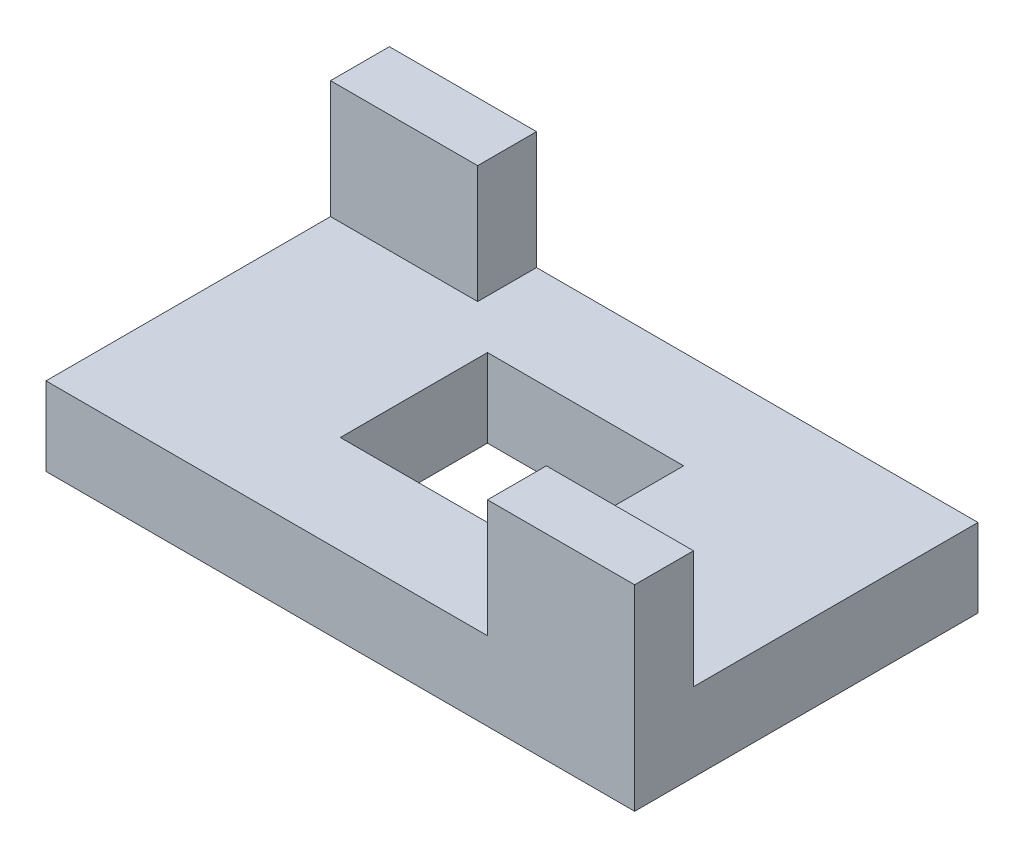
ISO-10303-21;
HEADER;
FILE_DESCRIPTION(('STEP AP214'),'2;1');
FILE_NAME('part.step','',(''),(''),'','','');
FILE_SCHEMA(('AUTOMOTIVE_DESIGN { 1 0 10303 214 1 1 1 1 }'));
ENDSEC;
DATA;
#1=APPLICATION_CONTEXT('core data for automotive mechanical design processes');
#2=APPLICATION_PROTOCOL_DEFINITION('international standard','automotive_design',2000,#1);
#3=PRODUCT_CONTEXT('',#1,'mechanical');
#4=PRODUCT('Part','Part','',(#3));
#5=PRODUCT_RELATED_PRODUCT_CATEGORY('part','',(#4));
#6=PRODUCT_DEFINITION_FORMATION('','',#4);
#7=PRODUCT_DEFINITION_CONTEXT('part definition',#1,'design');
#8=PRODUCT_DEFINITION('design','',#6,#7);
#9=PRODUCT_DEFINITION_SHAPE('','',#8);
#10=(LENGTH_UNIT() NAMED_UNIT(*) SI_UNIT(.MILLI.,.METRE.));
#11=(NAMED_UNIT(*) PLANE_ANGLE_UNIT() SI_UNIT($,.RADIAN.));
#12=(NAMED_UNIT(*) SI_UNIT($,.STERADIAN.) SOLID_ANGLE_UNIT());
#13=UNCERTAINTY_MEASURE_WITH_UNIT(LENGTH_MEASURE(1.E-05),#10,'distance_accuracy_value','');
#14=(GEOMETRIC_REPRESENTATION_CONTEXT(3) GLOBAL_UNCERTAINTY_ASSIGNED_CONTEXT((#13)) GLOBAL_UNIT_ASSIGNED_CONTEXT((#10,
#11,#12)) REPRESENTATION_CONTEXT('',''));
#15=CARTESIAN_POINT('',(0.,0.,0.));
#16=DIRECTION('',(0.,0.,1.));
#17=DIRECTION('',(1.,0.,0.));
#18=AXIS2_PLACEMENT_3D('',#15,#16,#17);
#19=CARTESIAN_POINT('',(0.,8.,0.));
#20=DIRECTION('',(0.,1.,0.));
#21=DIRECTION('',(0.,0.,1.));
#22=AXIS2_PLACEMENT_3D('',#19,#20,#21);
#23=PLANE('',#22);
#24=DIRECTION('',(-1.,0.,0.));
#25=VECTOR('',#24,1.);
#26=CARTESIAN_POINT('',(-10.,8.,-7.5));
#27=LINE('',#26,#25);
#28=CARTESIAN_POINT('',(10.,8.,-7.5));
#29=VERTEX_POINT('',#28);
#30=CARTESIAN_POINT('',(-10.,8.,-7.5));
#31=VERTEX_POINT('',#30);
#32=EDGE_CURVE('E189',#29,#31,#27,.T.);
#33=ORIENTED_EDGE('',*,*,#32,.F.);
#34=DIRECTION('',(0.,0.,-1.));
#35=VECTOR('',#34,1.);
#36=CARTESIAN_POINT('',(10.,8.,-7.5));
#37=LINE('',#36,#35);
#38=CARTESIAN_POINT('',(10.,8.,7.5));
#39=VERTEX_POINT('',#38);
#40=EDGE_CURVE('E187',#39,#29,#37,.T.);
#41=ORIENTED_EDGE('',*,*,#40,.F.);
#42=DIRECTION('',(1.,0.,0.));
#43=VECTOR('',#42,1.);
#44=CARTESIAN_POINT('',(-10.,8.,7.5));
#45=LINE('',#44,#43);
#46=CARTESIAN_POINT('',(-10.,8.,7.5));
#47=VERTEX_POINT('',#46);
#48=EDGE_CURVE('E193',#47,#39,#45,.T.);
#49=ORIENTED_EDGE('',*,*,#48,.F.);
#50=DIRECTION('',(0.,0.,1.));
#51=VECTOR('',#50,1.);
#52=CARTESIAN_POINT('',(-10.,8.,-7.5));
#53=LINE('',#52,#51);
#54=EDGE_CURVE('E194',#31,#47,#53,.T.);
#55=ORIENTED_EDGE('',*,*,#54,.F.);
#56=EDGE_LOOP('',(#33,#41,#49,#55));
#57=FACE_BOUND('',#56,.T.);
#58=DIRECTION('',(0.,0.,1.));
#59=VECTOR('',#58,1.);
#60=CARTESIAN_POINT('',(-15.,8.,0.));
#61=LINE('',#60,#59);
#62=CARTESIAN_POINT('',(-15.,8.,-17.5));
#63=VERTEX_POINT('',#62);
#64=CARTESIAN_POINT('',(-15.,8.,-11.5));
#65=VERTEX_POINT('',#64);
#66=EDGE_CURVE('E50',#63,#65,#61,.T.);
#67=ORIENTED_EDGE('',*,*,#66,.T.);
#68=DIRECTION('',(-1.,0.,0.));
#69=VECTOR('',#68,1.);
#70=CARTESIAN_POINT('',(0.,8.,-11.5));
#71=LINE('',#70,#69);
#72=CARTESIAN_POINT('',(-30.,8.,-11.5));
#73=VERTEX_POINT('',#72);
#74=EDGE_CURVE('E11',#65,#73,#71,.T.);
#75=ORIENTED_EDGE('',*,*,#74,.T.);
#76=DIRECTION('',(0.,0.,1.));
#77=VECTOR('',#76,1.);
#78=CARTESIAN_POINT('',(-30.,8.,-17.5));
#79=LINE('',#78,#77);
#80=CARTESIAN_POINT('',(-30.,8.,17.5));
#81=VERTEX_POINT('',#80);
#82=EDGE_CURVE('E161',#73,#81,#79,.T.);
#83=ORIENTED_EDGE('',*,*,#82,.T.);
#84=DIRECTION('',(1.,0.,0.));
#85=VECTOR('',#84,1.);
#86=CARTESIAN_POINT('',(-30.,8.,17.5));
#87=LINE('',#86,#85);
#88=CARTESIAN_POINT('',(15.,8.,17.5));
#89=VERTEX_POINT('',#88);
#90=EDGE_CURVE('E222',#81,#89,#87,.T.);
#91=ORIENTED_EDGE('',*,*,#90,.T.);
#92=DIRECTION('',(0.,0.,-1.));
#93=VECTOR('',#92,1.);
#94=CARTESIAN_POINT('',(15.,8.,0.));
#95=LINE('',#94,#93);
#96=CARTESIAN_POINT('',(15.,8.,11.5));
#97=VERTEX_POINT('',#96);
#98=EDGE_CURVE('E242',#89,#97,#95,.T.);
#99=ORIENTED_EDGE('',*,*,#98,.T.);
#100=DIRECTION('',(1.,0.,0.));
#101=VECTOR('',#100,1.);
#102=CARTESIAN_POINT('',(0.,8.,11.5));
#103=LINE('',#102,#101);
#104=CARTESIAN_POINT('',(30.,8.,11.5));
#105=VERTEX_POINT('',#104);
#106=EDGE_CURVE('E241',#97,#105,#103,.T.);
#107=ORIENTED_EDGE('',*,*,#106,.T.);
#108=DIRECTION('',(0.,0.,-1.));
#109=VECTOR('',#108,1.);
#110=CARTESIAN_POINT('',(30.,8.,-17.5));
#111=LINE('',#110,#109);
#112=CARTESIAN_POINT('',(30.,8.,-17.5));
#113=VERTEX_POINT('',#112);
#114=EDGE_CURVE('E212',#105,#113,#111,.T.);
#115=ORIENTED_EDGE('',*,*,#114,.T.);
#116=DIRECTION('',(-1.,0.,0.));
#117=VECTOR('',#116,1.);
#118=CARTESIAN_POINT('',(-30.,8.,-17.5));
#119=LINE('',#118,#117);
#120=EDGE_CURVE('E216',#113,#63,#119,.T.);
#121=ORIENTED_EDGE('',*,*,#120,.T.);
#122=EDGE_LOOP('',(#67,#75,#83,#91,#99,#107,#115,#121));
#123=FACE_BOUND('',#122,.T.);
#124=ADVANCED_FACE('F39',(#57,#123),#23,.T.);
#125=CARTESIAN_POINT('',(0.,0.,0.));
#126=DIRECTION('',(0.,1.,0.));
#127=DIRECTION('',(0.,0.,1.));
#128=AXIS2_PLACEMENT_3D('',#125,#126,#127);
#129=PLANE('',#128);
#130=DIRECTION('',(0.,0.,1.));
#131=VECTOR('',#130,1.);
#132=CARTESIAN_POINT('',(-30.,0.,-17.5));
#133=LINE('',#132,#131);
#134=CARTESIAN_POINT('',(-30.,0.,-17.5));
#135=VERTEX_POINT('',#134);
#136=CARTESIAN_POINT('',(-30.,0.,17.5));
#137=VERTEX_POINT('',#136);
#138=EDGE_CURVE('E229',#135,#137,#133,.T.);
#139=ORIENTED_EDGE('',*,*,#138,.F.);
#140=DIRECTION('',(-1.,0.,0.));
#141=VECTOR('',#140,1.);
#142=CARTESIAN_POINT('',(-30.,0.,-17.5));
#143=LINE('',#142,#141);
#144=CARTESIAN_POINT('',(30.,0.,-17.5));
#145=VERTEX_POINT('',#144);
#146=EDGE_CURVE('E227',#145,#135,#143,.T.);
#147=ORIENTED_EDGE('',*,*,#146,.F.);
#148=DIRECTION('',(0.,0.,-1.));
#149=VECTOR('',#148,1.);
#150=CARTESIAN_POINT('',(30.,0.,-17.5));
#151=LINE('',#150,#149);
#152=CARTESIAN_POINT('',(30.,0.,17.5));
#153=VERTEX_POINT('',#152);
#154=EDGE_CURVE('E213',#153,#145,#151,.T.);
#155=ORIENTED_EDGE('',*,*,#154,.F.);
#156=DIRECTION('',(1.,0.,0.));
#157=VECTOR('',#156,1.);
#158=CARTESIAN_POINT('',(-30.,0.,17.5));
#159=LINE('',#158,#157);
#160=EDGE_CURVE('E220',#137,#153,#159,.T.);
#161=ORIENTED_EDGE('',*,*,#160,.F.);
#162=EDGE_LOOP('',(#139,#147,#155,#161));
#163=FACE_BOUND('',#162,.T.);
#164=DIRECTION('',(0.,0.,-1.));
#165=VECTOR('',#164,1.);
#166=CARTESIAN_POINT('',(10.,0.,-7.5));
#167=LINE('',#166,#165);
#168=CARTESIAN_POINT('',(10.,0.,7.5));
#169=VERTEX_POINT('',#168);
#170=CARTESIAN_POINT('',(10.,0.,-7.5));
#171=VERTEX_POINT('',#170);
#172=EDGE_CURVE('E165',#169,#171,#167,.T.);
#173=ORIENTED_EDGE('',*,*,#172,.T.);
#174=DIRECTION('',(-1.,0.,0.));
#175=VECTOR('',#174,1.);
#176=CARTESIAN_POINT('',(-10.,0.,-7.5));
#177=LINE('',#176,#175);
#178=CARTESIAN_POINT('',(-10.,0.,-7.5));
#179=VERTEX_POINT('',#178);
#180=EDGE_CURVE('E164',#171,#179,#177,.T.);
#181=ORIENTED_EDGE('',*,*,#180,.T.);
#182=DIRECTION('',(0.,0.,1.));
#183=VECTOR('',#182,1.);
#184=CARTESIAN_POINT('',(-10.,0.,-7.5));
#185=LINE('',#184,#183);
#186=CARTESIAN_POINT('',(-10.,0.,7.5));
#187=VERTEX_POINT('',#186);
#188=EDGE_CURVE('E200',#179,#187,#185,.T.);
#189=ORIENTED_EDGE('',*,*,#188,.T.);
#190=DIRECTION('',(1.,0.,0.));
#191=VECTOR('',#190,1.);
#192=CARTESIAN_POINT('',(-10.,0.,7.5));
#193=LINE('',#192,#191);
#194=EDGE_CURVE('E186',#187,#169,#193,.T.);
#195=ORIENTED_EDGE('',*,*,#194,.T.);
#196=EDGE_LOOP('',(#173,#181,#189,#195));
#197=FACE_BOUND('',#196,.T.);
#198=ADVANCED_FACE('F261',(#163,#197),#129,.F.);
#199=CARTESIAN_POINT('',(30.,8.,-17.5));
#200=DIRECTION('',(-1.,0.,0.));
#201=DIRECTION('',(0.,0.,1.));
#202=AXIS2_PLACEMENT_3D('',#199,#200,#201);
#203=PLANE('',#202);
#204=ORIENTED_EDGE('',*,*,#114,.F.);
#205=DIRECTION('',(0.,-1.,0.));
#206=VECTOR('',#205,1.);
#207=CARTESIAN_POINT('',(30.,20.,11.5));
#208=LINE('',#207,#206);
#209=CARTESIAN_POINT('',(30.,20.,11.5));
#210=VERTEX_POINT('',#209);
#211=EDGE_CURVE('E172',#210,#105,#208,.T.);
#212=ORIENTED_EDGE('',*,*,#211,.F.);
#213=DIRECTION('',(0.,0.,-1.));
#214=VECTOR('',#213,1.);
#215=CARTESIAN_POINT('',(30.,20.,11.5));
#216=LINE('',#215,#214);
#217=CARTESIAN_POINT('',(30.,20.,17.5));
#218=VERTEX_POINT('',#217);
#219=EDGE_CURVE('E156',#218,#210,#216,.T.);
#220=ORIENTED_EDGE('',*,*,#219,.F.);
#221=DIRECTION('',(0.,-1.,0.));
#222=VECTOR('',#221,1.);
#223=CARTESIAN_POINT('',(30.,8.,17.5));
#224=LINE('',#223,#222);
#225=EDGE_CURVE('E221',#218,#153,#224,.T.);
#226=ORIENTED_EDGE('',*,*,#225,.T.);
#227=ORIENTED_EDGE('',*,*,#154,.T.);
#228=DIRECTION('',(0.,-1.,0.));
#229=VECTOR('',#228,1.);
#230=CARTESIAN_POINT('',(30.,8.,-17.5));
#231=LINE('',#230,#229);
#232=EDGE_CURVE('E236',#113,#145,#231,.T.);
#233=ORIENTED_EDGE('',*,*,#232,.F.);
#234=EDGE_LOOP('',(#204,#212,#220,#226,#227,#233));
#235=FACE_BOUND('',#234,.T.);
#236=ADVANCED_FACE('F41',(#235),#203,.F.);
#237=CARTESIAN_POINT('',(-30.,8.,-17.5));
#238=DIRECTION('',(0.,0.,1.));
#239=DIRECTION('',(1.,0.,0.));
#240=AXIS2_PLACEMENT_3D('',#237,#238,#239);
#241=PLANE('',#240);
#242=DIRECTION('',(0.,-1.,0.));
#243=VECTOR('',#242,1.);
#244=CARTESIAN_POINT('',(-30.,8.,-17.5));
#245=LINE('',#244,#243);
#246=CARTESIAN_POINT('',(-30.,20.,-17.5));
#247=VERTEX_POINT('',#246);
#248=EDGE_CURVE('E237',#247,#135,#245,.T.);
#249=ORIENTED_EDGE('',*,*,#248,.F.);
#250=DIRECTION('',(-1.,0.,0.));
#251=VECTOR('',#250,1.);
#252=CARTESIAN_POINT('',(-30.,20.,-17.5));
#253=LINE('',#252,#251);
#254=CARTESIAN_POINT('',(-15.,20.,-17.5));
#255=VERTEX_POINT('',#254);
#256=EDGE_CURVE('E153',#255,#247,#253,.T.);
#257=ORIENTED_EDGE('',*,*,#256,.F.);
#258=DIRECTION('',(0.,-1.,0.));
#259=VECTOR('',#258,1.);
#260=CARTESIAN_POINT('',(-15.,20.,-17.5));
#261=LINE('',#260,#259);
#262=EDGE_CURVE('E170',#255,#63,#261,.T.);
#263=ORIENTED_EDGE('',*,*,#262,.T.);
#264=ORIENTED_EDGE('',*,*,#120,.F.);
#265=ORIENTED_EDGE('',*,*,#232,.T.);
#266=ORIENTED_EDGE('',*,*,#146,.T.);
#267=EDGE_LOOP('',(#249,#257,#263,#264,#265,#266));
#268=FACE_BOUND('',#267,.T.);
#269=ADVANCED_FACE('F251',(#268),#241,.F.);
#270=CARTESIAN_POINT('',(-30.,8.,-17.5));
#271=DIRECTION('',(1.,0.,0.));
#272=DIRECTION('',(0.,0.,-1.));
#273=AXIS2_PLACEMENT_3D('',#270,#271,#272);
#274=PLANE('',#273);
#275=ORIENTED_EDGE('',*,*,#82,.F.);
#276=DIRECTION('',(0.,-1.,0.));
#277=VECTOR('',#276,1.);
#278=CARTESIAN_POINT('',(-30.,20.,-11.5));
#279=LINE('',#278,#277);
#280=CARTESIAN_POINT('',(-30.,20.,-11.5));
#281=VERTEX_POINT('',#280);
#282=EDGE_CURVE('E145',#281,#73,#279,.T.);
#283=ORIENTED_EDGE('',*,*,#282,.F.);
#284=DIRECTION('',(0.,0.,1.));
#285=VECTOR('',#284,1.);
#286=CARTESIAN_POINT('',(-30.,20.,-17.5));
#287=LINE('',#286,#285);
#288=EDGE_CURVE('E150',#247,#281,#287,.T.);
#289=ORIENTED_EDGE('',*,*,#288,.F.);
#290=ORIENTED_EDGE('',*,*,#248,.T.);
#291=ORIENTED_EDGE('',*,*,#138,.T.);
#292=DIRECTION('',(0.,-1.,0.));
#293=VECTOR('',#292,1.);
#294=CARTESIAN_POINT('',(-30.,8.,17.5));
#295=LINE('',#294,#293);
#296=EDGE_CURVE('E235',#81,#137,#295,.T.);
#297=ORIENTED_EDGE('',*,*,#296,.F.);
#298=EDGE_LOOP('',(#275,#283,#289,#290,#291,#297));
#299=FACE_BOUND('',#298,.T.);
#300=ADVANCED_FACE('F157',(#299),#274,.F.);
#301=CARTESIAN_POINT('',(-30.,8.,17.5));
#302=DIRECTION('',(0.,0.,-1.));
#303=DIRECTION('',(-1.,0.,0.));
#304=AXIS2_PLACEMENT_3D('',#301,#302,#303);
#305=PLANE('',#304);
#306=ORIENTED_EDGE('',*,*,#225,.F.);
#307=DIRECTION('',(1.,0.,0.));
#308=VECTOR('',#307,1.);
#309=CARTESIAN_POINT('',(30.,20.,17.5));
#310=LINE('',#309,#308);
#311=CARTESIAN_POINT('',(15.,20.,17.5));
#312=VERTEX_POINT('',#311);
#313=EDGE_CURVE('E176',#312,#218,#310,.T.);
#314=ORIENTED_EDGE('',*,*,#313,.F.);
#315=DIRECTION('',(0.,-1.,0.));
#316=VECTOR('',#315,1.);
#317=CARTESIAN_POINT('',(15.,20.,17.5));
#318=LINE('',#317,#316);
#319=EDGE_CURVE('E171',#312,#89,#318,.T.);
#320=ORIENTED_EDGE('',*,*,#319,.T.);
#321=ORIENTED_EDGE('',*,*,#90,.F.);
#322=ORIENTED_EDGE('',*,*,#296,.T.);
#323=ORIENTED_EDGE('',*,*,#160,.T.);
#324=EDGE_LOOP('',(#306,#314,#320,#321,#322,#323));
#325=FACE_BOUND('',#324,.T.);
#326=ADVANCED_FACE('F264',(#325),#305,.F.);
#327=CARTESIAN_POINT('',(10.,8.,-7.5));
#328=DIRECTION('',(-1.,0.,0.));
#329=DIRECTION('',(0.,0.,1.));
#330=AXIS2_PLACEMENT_3D('',#327,#328,#329);
#331=PLANE('',#330);
#332=ORIENTED_EDGE('',*,*,#172,.F.);
#333=DIRECTION('',(0.,-1.,0.));
#334=VECTOR('',#333,1.);
#335=CARTESIAN_POINT('',(10.,8.,7.5));
#336=LINE('',#335,#334);
#337=EDGE_CURVE('E192',#39,#169,#336,.T.);
#338=ORIENTED_EDGE('',*,*,#337,.F.);
#339=ORIENTED_EDGE('',*,*,#40,.T.);
#340=DIRECTION('',(0.,-1.,0.));
#341=VECTOR('',#340,1.);
#342=CARTESIAN_POINT('',(10.,8.,-7.5));
#343=LINE('',#342,#341);
#344=EDGE_CURVE('E209',#29,#171,#343,.T.);
#345=ORIENTED_EDGE('',*,*,#344,.T.);
#346=EDGE_LOOP('',(#332,#338,#339,#345));
#347=FACE_BOUND('',#346,.T.);
#348=ADVANCED_FACE('F300',(#347),#331,.T.);
#349=CARTESIAN_POINT('',(-10.,8.,-7.5));
#350=DIRECTION('',(0.,0.,1.));
#351=DIRECTION('',(1.,0.,0.));
#352=AXIS2_PLACEMENT_3D('',#349,#350,#351);
#353=PLANE('',#352);
#354=ORIENTED_EDGE('',*,*,#180,.F.);
#355=ORIENTED_EDGE('',*,*,#344,.F.);
#356=ORIENTED_EDGE('',*,*,#32,.T.);
#357=DIRECTION('',(0.,-1.,0.));
#358=VECTOR('',#357,1.);
#359=CARTESIAN_POINT('',(-10.,8.,-7.5));
#360=LINE('',#359,#358);
#361=EDGE_CURVE('E208',#31,#179,#360,.T.);
#362=ORIENTED_EDGE('',*,*,#361,.T.);
#363=EDGE_LOOP('',(#354,#355,#356,#362));
#364=FACE_BOUND('',#363,.T.);
#365=ADVANCED_FACE('F327',(#364),#353,.T.);
#366=CARTESIAN_POINT('',(-10.,8.,-7.5));
#367=DIRECTION('',(1.,0.,0.));
#368=DIRECTION('',(0.,0.,-1.));
#369=AXIS2_PLACEMENT_3D('',#366,#367,#368);
#370=PLANE('',#369);
#371=ORIENTED_EDGE('',*,*,#188,.F.);
#372=ORIENTED_EDGE('',*,*,#361,.F.);
#373=ORIENTED_EDGE('',*,*,#54,.T.);
#374=DIRECTION('',(0.,-1.,0.));
#375=VECTOR('',#374,1.);
#376=CARTESIAN_POINT('',(-10.,8.,7.5));
#377=LINE('',#376,#375);
#378=EDGE_CURVE('E206',#47,#187,#377,.T.);
#379=ORIENTED_EDGE('',*,*,#378,.T.);
#380=EDGE_LOOP('',(#371,#372,#373,#379));
#381=FACE_BOUND('',#380,.T.);
#382=ADVANCED_FACE('F337',(#381),#370,.T.);
#383=CARTESIAN_POINT('',(-10.,8.,7.5));
#384=DIRECTION('',(0.,0.,-1.));
#385=DIRECTION('',(-1.,0.,0.));
#386=AXIS2_PLACEMENT_3D('',#383,#384,#385);
#387=PLANE('',#386);
#388=ORIENTED_EDGE('',*,*,#194,.F.);
#389=ORIENTED_EDGE('',*,*,#378,.F.);
#390=ORIENTED_EDGE('',*,*,#48,.T.);
#391=ORIENTED_EDGE('',*,*,#337,.T.);
#392=EDGE_LOOP('',(#388,#389,#390,#391));
#393=FACE_BOUND('',#392,.T.);
#394=ADVANCED_FACE('F281',(#393),#387,.T.);
#395=CARTESIAN_POINT('',(30.,20.,11.5));
#396=DIRECTION('',(0.,0.,1.));
#397=DIRECTION('',(1.,0.,0.));
#398=AXIS2_PLACEMENT_3D('',#395,#396,#397);
#399=PLANE('',#398);
#400=ORIENTED_EDGE('',*,*,#106,.F.);
#401=DIRECTION('',(0.,-1.,0.));
#402=VECTOR('',#401,1.);
#403=CARTESIAN_POINT('',(15.,20.,11.5));
#404=LINE('',#403,#402);
#405=CARTESIAN_POINT('',(15.,20.,11.5));
#406=VERTEX_POINT('',#405);
#407=EDGE_CURVE('E65',#406,#97,#404,.T.);
#408=ORIENTED_EDGE('',*,*,#407,.F.);
#409=DIRECTION('',(-1.,0.,0.));
#410=VECTOR('',#409,1.);
#411=CARTESIAN_POINT('',(30.,20.,11.5));
#412=LINE('',#411,#410);
#413=EDGE_CURVE('E185',#210,#406,#412,.T.);
#414=ORIENTED_EDGE('',*,*,#413,.F.);
#415=ORIENTED_EDGE('',*,*,#211,.T.);
#416=EDGE_LOOP('',(#400,#408,#414,#415));
#417=FACE_BOUND('',#416,.T.);
#418=ADVANCED_FACE('F280',(#417),#399,.F.);
#419=CARTESIAN_POINT('',(15.,20.,11.5));
#420=DIRECTION('',(1.,0.,0.));
#421=DIRECTION('',(0.,0.,-1.));
#422=AXIS2_PLACEMENT_3D('',#419,#420,#421);
#423=PLANE('',#422);
#424=ORIENTED_EDGE('',*,*,#98,.F.);
#425=ORIENTED_EDGE('',*,*,#319,.F.);
#426=DIRECTION('',(0.,0.,1.));
#427=VECTOR('',#426,1.);
#428=CARTESIAN_POINT('',(15.,20.,11.5));
#429=LINE('',#428,#427);
#430=EDGE_CURVE('E177',#406,#312,#429,.T.);
#431=ORIENTED_EDGE('',*,*,#430,.F.);
#432=ORIENTED_EDGE('',*,*,#407,.T.);
#433=EDGE_LOOP('',(#424,#425,#431,#432));
#434=FACE_BOUND('',#433,.T.);
#435=ADVANCED_FACE('F274',(#434),#423,.F.);
#436=CARTESIAN_POINT('',(0.,20.,0.));
#437=DIRECTION('',(0.,-1.,0.));
#438=DIRECTION('',(0.,0.,-1.));
#439=AXIS2_PLACEMENT_3D('',#436,#437,#438);
#440=PLANE('',#439);
#441=ORIENTED_EDGE('',*,*,#219,.T.);
#442=ORIENTED_EDGE('',*,*,#413,.T.);
#443=ORIENTED_EDGE('',*,*,#430,.T.);
#444=ORIENTED_EDGE('',*,*,#313,.T.);
#445=EDGE_LOOP('',(#441,#442,#443,#444));
#446=FACE_BOUND('',#445,.T.);
#447=ADVANCED_FACE('F272',(#446),#440,.F.);
#448=CARTESIAN_POINT('',(-30.,20.,-11.5));
#449=DIRECTION('',(0.,0.,-1.));
#450=DIRECTION('',(-1.,0.,0.));
#451=AXIS2_PLACEMENT_3D('',#448,#449,#450);
#452=PLANE('',#451);
#453=ORIENTED_EDGE('',*,*,#74,.F.);
#454=DIRECTION('',(0.,-1.,0.));
#455=VECTOR('',#454,1.);
#456=CARTESIAN_POINT('',(-15.,20.,-11.5));
#457=LINE('',#456,#455);
#458=CARTESIAN_POINT('',(-15.,20.,-11.5));
#459=VERTEX_POINT('',#458);
#460=EDGE_CURVE('E53',#459,#65,#457,.T.);
#461=ORIENTED_EDGE('',*,*,#460,.F.);
#462=DIRECTION('',(1.,0.,0.));
#463=VECTOR('',#462,1.);
#464=CARTESIAN_POINT('',(-30.,20.,-11.5));
#465=LINE('',#464,#463);
#466=EDGE_CURVE('E137',#281,#459,#465,.T.);
#467=ORIENTED_EDGE('',*,*,#466,.F.);
#468=ORIENTED_EDGE('',*,*,#282,.T.);
#469=EDGE_LOOP('',(#453,#461,#467,#468));
#470=FACE_BOUND('',#469,.T.);
#471=ADVANCED_FACE('F142',(#470),#452,.F.);
#472=CARTESIAN_POINT('',(-15.,20.,-17.5));
#473=DIRECTION('',(-1.,0.,0.));
#474=DIRECTION('',(0.,0.,1.));
#475=AXIS2_PLACEMENT_3D('',#472,#473,#474);
#476=PLANE('',#475);
#477=ORIENTED_EDGE('',*,*,#66,.F.);
#478=ORIENTED_EDGE('',*,*,#262,.F.);
#479=DIRECTION('',(0.,0.,-1.));
#480=VECTOR('',#479,1.);
#481=CARTESIAN_POINT('',(-15.,20.,-17.5));
#482=LINE('',#481,#480);
#483=EDGE_CURVE('E148',#459,#255,#482,.T.);
#484=ORIENTED_EDGE('',*,*,#483,.F.);
#485=ORIENTED_EDGE('',*,*,#460,.T.);
#486=EDGE_LOOP('',(#477,#478,#484,#485));
#487=FACE_BOUND('',#486,.T.);
#488=ADVANCED_FACE('F253',(#487),#476,.F.);
#489=CARTESIAN_POINT('',(0.,20.,0.));
#490=DIRECTION('',(0.,1.,0.));
#491=DIRECTION('',(0.,0.,1.));
#492=AXIS2_PLACEMENT_3D('',#489,#490,#491);
#493=PLANE('',#492);
#494=ORIENTED_EDGE('',*,*,#288,.T.);
#495=ORIENTED_EDGE('',*,*,#466,.T.);
#496=ORIENTED_EDGE('',*,*,#483,.T.);
#497=ORIENTED_EDGE('',*,*,#256,.T.);
#498=EDGE_LOOP('',(#494,#495,#496,#497));
#499=FACE_BOUND('',#498,.T.);
#500=ADVANCED_FACE('F151',(#499),#493,.T.);
#501=CLOSED_SHELL('',(#124,#198,#236,#269,#300,#326,#348,#365,#382,#394,#418,#435,#447,#471,
#488,#500));
#502=MANIFOLD_SOLID_BREP('B2',#501);
#503=ADVANCED_BREP_SHAPE_REPRESENTATION('',(#18,#502),#14);
#504=SHAPE_DEFINITION_REPRESENTATION(#9,#503);
ENDSEC;
END-ISO-10303-21;
